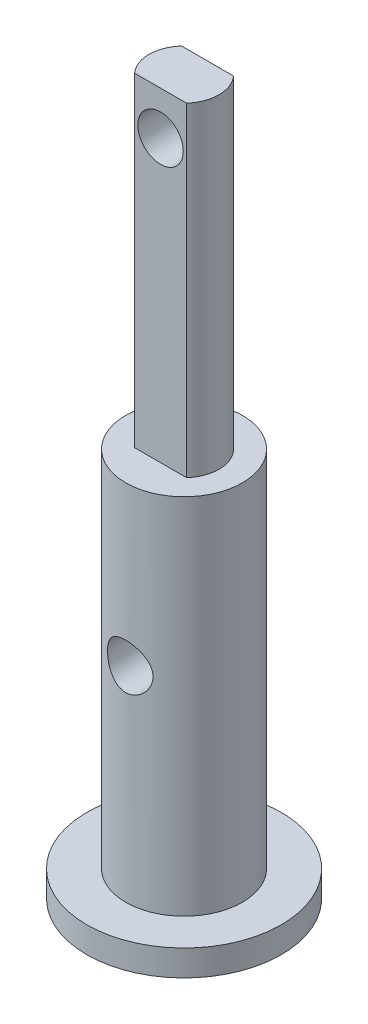
ISO-10303-21;
HEADER;
FILE_DESCRIPTION(('STEP AP214'),'2;1');
FILE_NAME('part.step','',(''),(''),'','','');
FILE_SCHEMA(('AUTOMOTIVE_DESIGN { 1 0 10303 214 1 1 1 1 }'));
ENDSEC;
DATA;
#1=APPLICATION_CONTEXT('core data for automotive mechanical design processes');
#2=APPLICATION_PROTOCOL_DEFINITION('international standard','automotive_design',2000,#1);
#3=PRODUCT_CONTEXT('',#1,'mechanical');
#4=PRODUCT('Part','Part','',(#3));
#5=PRODUCT_RELATED_PRODUCT_CATEGORY('part','',(#4));
#6=PRODUCT_DEFINITION_FORMATION('','',#4);
#7=PRODUCT_DEFINITION_CONTEXT('part definition',#1,'design');
#8=PRODUCT_DEFINITION('design','',#6,#7);
#9=PRODUCT_DEFINITION_SHAPE('','',#8);
#10=(LENGTH_UNIT() NAMED_UNIT(*) SI_UNIT(.MILLI.,.METRE.));
#11=(NAMED_UNIT(*) PLANE_ANGLE_UNIT() SI_UNIT($,.RADIAN.));
#12=(NAMED_UNIT(*) SI_UNIT($,.STERADIAN.) SOLID_ANGLE_UNIT());
#13=UNCERTAINTY_MEASURE_WITH_UNIT(LENGTH_MEASURE(1.E-05),#10,'distance_accuracy_value','');
#14=(GEOMETRIC_REPRESENTATION_CONTEXT(3) GLOBAL_UNCERTAINTY_ASSIGNED_CONTEXT((#13)) GLOBAL_UNIT_ASSIGNED_CONTEXT((#10,
#11,#12)) REPRESENTATION_CONTEXT('',''));
#15=CARTESIAN_POINT('',(0.,0.,0.));
#16=DIRECTION('',(0.,0.,1.));
#17=DIRECTION('',(1.,0.,0.));
#18=AXIS2_PLACEMENT_3D('',#15,#16,#17);
#19=CARTESIAN_POINT('',(0.,55.,0.));
#20=DIRECTION('',(0.,-1.,0.));
#21=DIRECTION('',(0.,0.,-1.));
#22=AXIS2_PLACEMENT_3D('',#19,#20,#21);
#23=CYLINDRICAL_SURFACE('',#22,4.5);
#24=CARTESIAN_POINT('',(0.,2.,0.));
#25=DIRECTION('',(0.,1.,0.));
#26=DIRECTION('',(0.,0.,1.));
#27=AXIS2_PLACEMENT_3D('',#24,#25,#26);
#28=CIRCLE('',#27,4.5);
#29=CARTESIAN_POINT('',(0.,2.,4.5));
#30=VERTEX_POINT('',#29);
#31=EDGE_CURVE('E143',#30,#30,#28,.T.);
#32=ORIENTED_EDGE('',*,*,#31,.T.);
#33=EDGE_LOOP('',(#32));
#34=FACE_BOUND('',#33,.T.);
#35=CARTESIAN_POINT('',(0.,30.,0.));
#36=DIRECTION('',(0.,1.,0.));
#37=DIRECTION('',(0.,0.,1.));
#38=AXIS2_PLACEMENT_3D('',#35,#36,#37);
#39=CIRCLE('',#38,4.5);
#40=CARTESIAN_POINT('',(0.,30.,4.5));
#41=VERTEX_POINT('',#40);
#42=EDGE_CURVE('E134',#41,#41,#39,.T.);
#43=ORIENTED_EDGE('',*,*,#42,.F.);
#44=EDGE_LOOP('',(#43));
#45=FACE_BOUND('',#44,.T.);
#46=CARTESIAN_POINT('',(1.75,17.75,4.14578098794425));
#47=CARTESIAN_POINT('',(1.75000491956867,17.8442150160928,4.14577620766959));
#48=CARTESIAN_POINT('',(1.74236653088156,17.9383991400736,4.14902733334679));
#49=CARTESIAN_POINT('',(1.71216780106661,18.1239108723661,4.16157989952544));
#50=CARTESIAN_POINT('',(1.68960873180986,18.2152387234578,4.17088082432782));
#51=CARTESIAN_POINT('',(1.63053548266134,18.392300175653,4.19432344476128));
#52=CARTESIAN_POINT('',(1.59405703251661,18.4780474473323,4.20845273680748));
#53=CARTESIAN_POINT('',(1.50830834046777,18.6422392853806,4.23993936412618));
#54=CARTESIAN_POINT('',(1.45903396823573,18.7206814826555,4.25729774118379));
#55=CARTESIAN_POINT('',(1.34626700880054,18.872236707857,4.29432746316903));
#56=CARTESIAN_POINT('',(1.28219880522748,18.9449040919029,4.31407028443289));
#57=CARTESIAN_POINT('',(1.14288162045414,19.078780700245,4.35305062896929));
#58=CARTESIAN_POINT('',(1.06763002363887,19.1399872364453,4.37228803279091));
#59=CARTESIAN_POINT('',(0.904654768169234,19.2513974018933,4.40894770380409));
#60=CARTESIAN_POINT('',(0.816572746996892,19.3011103215461,4.42627651449112));
#61=CARTESIAN_POINT('',(0.632501647053099,19.3848249270475,4.4563010064987));
#62=CARTESIAN_POINT('',(0.536515550519501,19.4188325068666,4.46899842553209));
#63=CARTESIAN_POINT('',(0.344050508253975,19.4685891340159,4.48782156001517));
#64=CARTESIAN_POINT('',(0.247797763460498,19.4851068003136,4.49422295127398));
#65=CARTESIAN_POINT('',(0.053687834449178,19.5018842291647,4.50072598926983));
#66=CARTESIAN_POINT('',(-0.0441687765833056,19.502149678412,4.50082983953306));
#67=CARTESIAN_POINT('',(-0.233174129943399,19.4868483040001,4.49489726026475));
#68=CARTESIAN_POINT('',(-0.324402981510445,19.472122115822,4.48918685447191));
#69=CARTESIAN_POINT('',(-0.502976620622431,19.4286782303249,4.4727015065481));
#70=CARTESIAN_POINT('',(-0.590321130735727,19.3999595353638,4.46192620330041));
#71=CARTESIAN_POINT('',(-0.760195076521448,19.3289888879838,4.43616953645727));
#72=CARTESIAN_POINT('',(-0.842633563402192,19.2865419858612,4.42112799285034));
#73=CARTESIAN_POINT('',(-0.999427181269501,19.1894977009259,4.38834487559258));
#74=CARTESIAN_POINT('',(-1.07377959313019,19.1348962495612,4.37060239847522));
#75=CARTESIAN_POINT('',(-1.21721796615108,19.0111126204878,4.33292278877973));
#76=CARTESIAN_POINT('',(-1.28568491942954,18.9412327457279,4.31291779588564));
#77=CARTESIAN_POINT('',(-1.41017275772126,18.7908853932342,4.27383661959412));
#78=CARTESIAN_POINT('',(-1.46619001365826,18.7104148391816,4.2547607082852));
#79=CARTESIAN_POINT('',(-1.56549698383146,18.5385505307153,4.21925110339265));
#80=CARTESIAN_POINT('',(-1.60842680262267,18.4469310346612,4.2028969394915));
#81=CARTESIAN_POINT('',(-1.67800752290595,18.2569582628716,4.17560826147973));
#82=CARTESIAN_POINT('',(-1.70466830932826,18.1586091165,4.1646704571967));
#83=CARTESIAN_POINT('',(-1.73949254719701,17.9641197895499,4.15024126483539));
#84=CARTESIAN_POINT('',(-1.74864666859994,17.8681868484455,4.14635176720071));
#85=CARTESIAN_POINT('',(-1.75107315977272,17.6760977564343,4.14532846788437));
#86=CARTESIAN_POINT('',(-1.74434994693427,17.5799416750457,4.14819278715552));
#87=CARTESIAN_POINT('',(-1.71611302180106,17.3954437403132,4.15994768707806));
#88=CARTESIAN_POINT('',(-1.69539557175102,17.3069568519628,4.16851349196302));
#89=CARTESIAN_POINT('',(-1.64077712714897,17.1347654316745,4.19031128967705));
#90=CARTESIAN_POINT('',(-1.6068733092301,17.0510619283246,4.20354428175289));
#91=CARTESIAN_POINT('',(-1.52535390234436,16.88715535,4.23382230250486));
#92=CARTESIAN_POINT('',(-1.47725249320867,16.8072184934821,4.25099653326073));
#93=CARTESIAN_POINT('',(-1.36920895274044,16.6562017163722,4.28701595404022));
#94=CARTESIAN_POINT('',(-1.30926221352474,16.5851252601167,4.30586179274909));
#95=CARTESIAN_POINT('',(-1.1743351898694,16.4487473219962,4.34467372079203));
#96=CARTESIAN_POINT('',(-1.09860240917596,16.3841840654039,4.36462725336802));
#97=CARTESIAN_POINT('',(-0.936894214477023,16.268579819505,4.40217110719148));
#98=CARTESIAN_POINT('',(-0.850918567711629,16.2175391375717,4.41976137471655));
#99=CARTESIAN_POINT('',(-0.671034282103451,16.1306899990885,4.45061965359563));
#100=CARTESIAN_POINT('',(-0.57714026964596,16.0948541649697,4.4638954233764));
#101=CARTESIAN_POINT('',(-0.384017264458009,16.0397073484483,4.48463385344078));
#102=CARTESIAN_POINT('',(-0.284791020586052,16.0203879367722,4.49209947879816));
#103=CARTESIAN_POINT('',(-0.09046783593177,15.9997816848924,4.50007593038988));
#104=CARTESIAN_POINT('',(0.00450254741818884,15.9974488962156,4.50099010179516));
#105=CARTESIAN_POINT('',(0.193429667217862,16.0081523229848,4.49683312605338));
#106=CARTESIAN_POINT('',(0.287386540229063,16.0211864411002,4.49176279569256));
#107=CARTESIAN_POINT('',(0.468953190894024,16.0615110066291,4.47640068008718));
#108=CARTESIAN_POINT('',(0.556666794983186,16.0883951772457,4.46625792486151));
#109=CARTESIAN_POINT('',(0.72633325835267,16.155240152611,4.44182328641121));
#110=CARTESIAN_POINT('',(0.808285024352276,16.1952034309654,4.42753061838587));
#111=CARTESIAN_POINT('',(0.967998954883363,16.289032859464,4.39544096241812));
#112=CARTESIAN_POINT('',(1.04542560274751,16.3434264992434,4.37751894300444));
#113=CARTESIAN_POINT('',(1.1903666728042,16.4637621620976,4.34034965591831));
#114=CARTESIAN_POINT('',(1.25787744646467,16.5297084164686,4.32110190425195));
#115=CARTESIAN_POINT('',(1.38509600830639,16.6757937533034,4.28207807683418));
#116=CARTESIAN_POINT('',(1.44412846688135,16.7565323488612,4.26233563443846));
#117=CARTESIAN_POINT('',(1.54784334935148,16.9273991909808,4.22577986123555));
#118=CARTESIAN_POINT('',(1.59252211256594,17.0175298250824,4.20896727814162));
#119=CARTESIAN_POINT('',(1.66878219150546,17.2120563584456,4.17935236080739));
#120=CARTESIAN_POINT('',(1.69910149724132,17.317016049265,4.16695473443663));
#121=CARTESIAN_POINT('',(1.73969940761536,17.5313334530595,4.15017507674994));
#122=CARTESIAN_POINT('',(1.74999429209613,17.6406875195152,4.14578653423297));
#123=CARTESIAN_POINT('',(1.75,17.75,4.14578098794425));
#124=B_SPLINE_CURVE_WITH_KNOTS('',3,(#46,#47,#48,#49,#50,#51,#52,#53,#54,#55,#56,#57,#58,#59,
#60,#61,#62,#63,#64,#65,#66,#67,#68,#69,#70,#71,#72,#73,#74,#75,#76,#77,#78,#79,#80,#81,#82,#83,
#84,#85,#86,#87,#88,#89,#90,#91,#92,#93,#94,#95,#96,#97,#98,#99,#100,#101,#102,#103,#104,#105,
#106,#107,#108,#109,#110,#111,#112,#113,#114,#115,#116,#117,#118,#119,#120,#121,#122,#123),
.UNSPECIFIED.,.T.,.F.,(4,2,2,2,2,2,2,2,2,2,2,2,2,2,2,2,2,2,2,2,2,2,2,2,2,2,2,2,2,2,2,2,2,2,2,2,
2,2,4),(0.,0.282237235150779,0.564450414889369,0.845944000670505,1.12752856145902,
1.42282786999549,1.718196353281,2.02448986264011,2.33066833119899,2.6227486960292,
2.91472686058053,3.19118823225721,3.46766931804866,3.74826299367323,4.02895073540889,
4.32717019309611,4.6254764678167,4.93136883476675,5.23707515849219,5.52490132525224,
5.81264742245516,6.08526400792906,6.35793899619764,6.64131312458807,6.92479770449228,
7.22786739678048,7.5309439773683,7.83347250384939,8.13584654042273,8.41943097575282,
8.70297671093821,8.97864219222514,9.2543598393148,9.54202720595761,9.8298001556641,
10.1341837751573,10.4386449613189,10.7663757962473,11.0938400746497),.UNSPECIFIED.);
#125=CARTESIAN_POINT('',(1.75,17.75,4.14578098794425));
#126=VERTEX_POINT('',#125);
#127=EDGE_CURVE('E153',#126,#126,#124,.T.);
#128=ORIENTED_EDGE('',*,*,#127,.F.);
#129=EDGE_LOOP('',(#128));
#130=FACE_BOUND('',#129,.T.);
#131=CARTESIAN_POINT('',(0.,19.5,-4.5));
#132=CARTESIAN_POINT('',(0.0945216116231121,19.5000046611473,-4.50000357890976));
#133=CARTESIAN_POINT('',(0.189012588974275,19.4923185058166,-4.49699657235603));
#134=CARTESIAN_POINT('',(0.375157095621193,19.4619126053374,-4.48530338756881));
#135=CARTESIAN_POINT('',(0.466811257942965,19.4391962398206,-4.47661848604882));
#136=CARTESIAN_POINT('',(0.644569415695736,19.3796639572406,-4.45449751263017));
#137=CARTESIAN_POINT('',(0.730684201241586,19.342876484572,-4.44107102989426));
#138=CARTESIAN_POINT('',(0.895509610305322,19.2563966061002,-4.41079282434057));
#139=CARTESIAN_POINT('',(0.974218091743783,19.2067004823406,-4.39394011500362));
#140=CARTESIAN_POINT('',(1.12555176600737,19.0934746560063,-4.35768696402247));
#141=CARTESIAN_POINT('',(1.19779891271444,19.0294641879905,-4.33821073882029));
#142=CARTESIAN_POINT('',(1.33084266886211,18.8904473299816,-4.29926410972336));
#143=CARTESIAN_POINT('',(1.39163537873751,18.8154372106502,-4.27979371005603));
#144=CARTESIAN_POINT('',(1.5025400591669,18.6527508484564,-4.24216350922567));
#145=CARTESIAN_POINT('',(1.55210248066998,18.5646774942171,-4.22409192828478));
#146=CARTESIAN_POINT('',(1.63554172723799,18.3806336879447,-4.19249433932349));
#147=CARTESIAN_POINT('',(1.66942535668049,18.2846666829832,-4.1789663601433));
#148=CARTESIAN_POINT('',(1.71902708764804,18.0919231620596,-4.15880257084895));
#149=CARTESIAN_POINT('',(1.73547043602239,17.9953629498096,-4.15189286416949));
#150=CARTESIAN_POINT('',(1.75199151472945,17.8006254802364,-4.14495045931833));
#151=CARTESIAN_POINT('',(1.75207667610848,17.7024489774177,-4.14491463854117));
#152=CARTESIAN_POINT('',(1.73643069370047,17.5140804405754,-4.15148930319339));
#153=CARTESIAN_POINT('',(1.72172945761323,17.4237848811768,-4.15766700235832));
#154=CARTESIAN_POINT('',(1.67863865338661,17.2470609047274,-4.17524945770577));
#155=CARTESIAN_POINT('',(1.65024686146123,17.1606331184205,-4.18665506305328));
#156=CARTESIAN_POINT('',(1.58005179443055,16.9920829709595,-4.21365271626082));
#157=CARTESIAN_POINT('',(1.53799445721783,16.9100795174722,-4.22932307646113));
#158=CARTESIAN_POINT('',(1.4418398712837,16.7540045314757,-4.26306100406182));
#159=CARTESIAN_POINT('',(1.3877382532953,16.6799358919347,-4.28112944044196));
#160=CARTESIAN_POINT('',(1.26440337893232,16.5361664466813,-4.31922892923803));
#161=CARTESIAN_POINT('',(1.19435591484142,16.4671748241548,-4.33930715956177));
#162=CARTESIAN_POINT('',(1.04346328587166,16.3416980466897,-4.37804136065515));
#163=CARTESIAN_POINT('',(0.962616205925904,16.285215114616,-4.39669707825065));
#164=CARTESIAN_POINT('',(0.79049955101908,16.1854965215154,-4.43090662383363));
#165=CARTESIAN_POINT('',(0.699070445395454,16.1425138017854,-4.44639951393914));
#166=CARTESIAN_POINT('',(0.509524956315268,16.072779641107,-4.47208114014078));
#167=CARTESIAN_POINT('',(0.411411801645559,16.0460204242378,-4.48227241696576));
#168=CARTESIAN_POINT('',(0.217238781026642,16.0108950453183,-4.49574685184384));
#169=CARTESIAN_POINT('',(0.121376185198679,16.0015749630205,-4.49938783597809));
#170=CARTESIAN_POINT('',(-0.0706022558697274,15.9987933405476,-4.50046894131888));
#171=CARTESIAN_POINT('',(-0.166718034214668,16.0053279634131,-4.49791056281854));
#172=CARTESIAN_POINT('',(-0.352242008871048,16.0333578281044,-4.48711560256918));
#173=CARTESIAN_POINT('',(-0.441762429458591,16.0542138123407,-4.47912178447378));
#174=CARTESIAN_POINT('',(-0.615959651152386,16.1094372848695,-4.45850787906716));
#175=CARTESIAN_POINT('',(-0.700635823764016,16.1438065218434,-4.44588719303079));
#176=CARTESIAN_POINT('',(-0.865605234361161,16.2261940265154,-4.41678144851863));
#177=CARTESIAN_POINT('',(-0.94568963809834,16.2745922237463,-4.40019144454658));
#178=CARTESIAN_POINT('',(-1.09687647672476,16.3832389438563,-4.3649625001582));
#179=CARTESIAN_POINT('',(-1.16797541280995,16.4434920596534,-4.34632276685946));
#180=CARTESIAN_POINT('',(-1.30382380300945,16.5785567745889,-4.3075912210957));
#181=CARTESIAN_POINT('',(-1.36789970134047,16.6540424457462,-4.28748140660687));
#182=CARTESIAN_POINT('',(-1.48262564949144,16.8150697621129,-4.24917515368351));
#183=CARTESIAN_POINT('',(-1.53327397046124,16.9006127001879,-4.23097896181674));
#184=CARTESIAN_POINT('',(-1.61989819212988,17.0803396652427,-4.19858244892526));
#185=CARTESIAN_POINT('',(-1.65576827914436,17.1745802905001,-4.18441116332615));
#186=CARTESIAN_POINT('',(-1.71087089906813,17.3684763129435,-4.16218937940006));
#187=CARTESIAN_POINT('',(-1.73011480230192,17.4681279599887,-4.15413469850287));
#188=CARTESIAN_POINT('',(-1.75036340880478,17.6626580753337,-4.14564074731701));
#189=CARTESIAN_POINT('',(-1.75252783727917,17.7573955531328,-4.14471735003347));
#190=CARTESIAN_POINT('',(-1.74156812524649,17.9458122352943,-4.14933433805868));
#191=CARTESIAN_POINT('',(-1.72844567598556,18.039491555567,-4.15487400833349));
#192=CARTESIAN_POINT('',(-1.68821256290743,18.219756054294,-4.17137652703369));
#193=CARTESIAN_POINT('',(-1.66161232658634,18.3064749324517,-4.18214092060007));
#194=CARTESIAN_POINT('',(-1.59564352261878,18.474260924601,-4.20775087444452));
#195=CARTESIAN_POINT('',(-1.55627161906199,18.5553265552574,-4.22259750083155));
#196=CARTESIAN_POINT('',(-1.46336245966471,18.7143724384423,-4.25571696636597));
#197=CARTESIAN_POINT('',(-1.40916363976662,18.7919358525947,-4.27413362217158));
#198=CARTESIAN_POINT('',(-1.28913141336766,18.9372352512418,-4.31185518542399));
#199=CARTESIAN_POINT('',(-1.22329417160084,19.0049679827436,-4.33116038412078));
#200=CARTESIAN_POINT('',(-1.07714479787779,19.1328363512943,-4.36987394857856));
#201=CARTESIAN_POINT('',(-0.99620157892544,19.1922732624713,-4.38921913759408));
#202=CARTESIAN_POINT('',(-0.824791042184334,19.2967041336143,-4.42463279405307));
#203=CARTESIAN_POINT('',(-0.734321732852542,19.3416950654829,-4.44070057424458));
#204=CARTESIAN_POINT('',(-0.539177942484051,19.4184053086274,-4.46874642995128));
#205=CARTESIAN_POINT('',(-0.433946807083797,19.4488710538204,-4.480325733796));
#206=CARTESIAN_POINT('',(-0.219128275784338,19.4896595854111,-4.49594815787146));
#207=CARTESIAN_POINT('',(-0.109543565297218,19.4999945980747,-4.49999585230798));
#208=CARTESIAN_POINT('',(0.,19.5,-4.5));
#209=B_SPLINE_CURVE_WITH_KNOTS('',3,(#131,#132,#133,#134,#135,#136,#137,#138,#139,#140,#141,
#142,#143,#144,#145,#146,#147,#148,#149,#150,#151,#152,#153,#154,#155,#156,#157,#158,#159,#160,
#161,#162,#163,#164,#165,#166,#167,#168,#169,#170,#171,#172,#173,#174,#175,#176,#177,#178,#179,
#180,#181,#182,#183,#184,#185,#186,#187,#188,#189,#190,#191,#192,#193,#194,#195,#196,#197,#198,
#199,#200,#201,#202,#203,#204,#205,#206,#207,#208),.UNSPECIFIED.,.T.,.F.,(4,2,2,2,2,2,2,2,2,2,2,
2,2,2,2,2,2,2,2,2,2,2,2,2,2,2,2,2,2,2,2,2,2,2,2,2,2,2,4),(0.,0.283160503864036,
0.566257359041776,0.84878493978484,1.13139398467333,1.42550694762591,1.71971985862072,
2.02617249149161,2.33249200315933,2.62550346855177,2.91838182708358,3.19218218311022,
3.46602702809766,3.74528609985655,4.02464664313579,4.32431978760004,4.6240461430173,
4.92909277058724,5.23399307356053,5.5216638359586,5.8092649867878,6.08479830266446,
6.36036728564719,6.64423643005734,6.92821577043194,7.22992485806411,7.53167277301019,
7.83554518222,8.13920961411628,8.42206063024588,8.70488035644986,8.97771101372535,
9.2506129907764,9.53856816273043,9.82661840345188,10.1319344787653,10.437314511264,
10.7656761078697,11.0938382139952),.UNSPECIFIED.);
#210=CARTESIAN_POINT('',(0.,19.5,-4.5));
#211=VERTEX_POINT('',#210);
#212=EDGE_CURVE('E43',#211,#211,#209,.T.);
#213=ORIENTED_EDGE('',*,*,#212,.F.);
#214=EDGE_LOOP('',(#213));
#215=FACE_BOUND('',#214,.T.);
#216=ADVANCED_FACE('F39',(#34,#45,#130,#215),#23,.T.);
#217=CARTESIAN_POINT('',(0.,2.,0.));
#218=DIRECTION('',(0.,1.,0.));
#219=DIRECTION('',(0.,0.,1.));
#220=AXIS2_PLACEMENT_3D('',#217,#218,#219);
#221=PLANE('',#220);
#222=CARTESIAN_POINT('',(0.,2.,0.));
#223=DIRECTION('',(0.,1.,0.));
#224=DIRECTION('',(0.,0.,1.));
#225=AXIS2_PLACEMENT_3D('',#222,#223,#224);
#226=CIRCLE('',#225,7.5);
#227=CARTESIAN_POINT('',(0.,2.,7.5));
#228=VERTEX_POINT('',#227);
#229=EDGE_CURVE('E11',#228,#228,#226,.T.);
#230=ORIENTED_EDGE('',*,*,#229,.T.);
#231=EDGE_LOOP('',(#230));
#232=FACE_BOUND('',#231,.T.);
#233=ORIENTED_EDGE('',*,*,#31,.F.);
#234=EDGE_LOOP('',(#233));
#235=FACE_BOUND('',#234,.T.);
#236=ADVANCED_FACE('F191',(#232,#235),#221,.T.);
#237=CARTESIAN_POINT('',(0.,0.,0.));
#238=DIRECTION('',(0.,1.,0.));
#239=DIRECTION('',(0.,0.,1.));
#240=AXIS2_PLACEMENT_3D('',#237,#238,#239);
#241=PLANE('',#240);
#242=CARTESIAN_POINT('',(0.,0.,0.));
#243=DIRECTION('',(0.,1.,0.));
#244=DIRECTION('',(0.,0.,1.));
#245=AXIS2_PLACEMENT_3D('',#242,#243,#244);
#246=CIRCLE('',#245,7.5);
#247=CARTESIAN_POINT('',(0.,0.,7.5));
#248=VERTEX_POINT('',#247);
#249=EDGE_CURVE('E54',#248,#248,#246,.T.);
#250=ORIENTED_EDGE('',*,*,#249,.F.);
#251=EDGE_LOOP('',(#250));
#252=FACE_BOUND('',#251,.T.);
#253=ADVANCED_FACE('F196',(#252),#241,.F.);
#254=CARTESIAN_POINT('',(0.,2.,0.));
#255=DIRECTION('',(0.,-1.,0.));
#256=DIRECTION('',(0.,0.,-1.));
#257=AXIS2_PLACEMENT_3D('',#254,#255,#256);
#258=CYLINDRICAL_SURFACE('',#257,7.5);
#259=ORIENTED_EDGE('',*,*,#229,.F.);
#260=EDGE_LOOP('',(#259));
#261=FACE_BOUND('',#260,.T.);
#262=ORIENTED_EDGE('',*,*,#249,.T.);
#263=EDGE_LOOP('',(#262));
#264=FACE_BOUND('',#263,.T.);
#265=ADVANCED_FACE('F41',(#261,#264),#258,.T.);
#266=CARTESIAN_POINT('',(0.,30.,0.));
#267=DIRECTION('',(0.,1.,0.));
#268=DIRECTION('',(0.,0.,1.));
#269=AXIS2_PLACEMENT_3D('',#266,#267,#268);
#270=PLANE('',#269);
#271=DIRECTION('',(-1.,0.,0.));
#272=VECTOR('',#271,1.);
#273=CARTESIAN_POINT('',(-2.,30.,-1.8113761853665));
#274=LINE('',#273,#272);
#275=CARTESIAN_POINT('',(2.,30.,-1.8113761853665));
#276=VERTEX_POINT('',#275);
#277=CARTESIAN_POINT('',(-2.,30.,-1.8113761853665));
#278=VERTEX_POINT('',#277);
#279=EDGE_CURVE('E101',#276,#278,#274,.T.);
#280=ORIENTED_EDGE('',*,*,#279,.F.);
#281=CARTESIAN_POINT('',(0.,30.,0.));
#282=DIRECTION('',(0.,1.,0.));
#283=DIRECTION('',(0.,0.,1.));
#284=AXIS2_PLACEMENT_3D('',#281,#282,#283);
#285=CIRCLE('',#284,2.69834832534884);
#286=CARTESIAN_POINT('',(2.,30.,1.8113761853665));
#287=VERTEX_POINT('',#286);
#288=EDGE_CURVE('E70',#287,#276,#285,.T.);
#289=ORIENTED_EDGE('',*,*,#288,.F.);
#290=DIRECTION('',(1.,0.,0.));
#291=VECTOR('',#290,1.);
#292=CARTESIAN_POINT('',(-2.,30.,1.8113761853665));
#293=LINE('',#292,#291);
#294=CARTESIAN_POINT('',(-2.,30.,1.8113761853665));
#295=VERTEX_POINT('',#294);
#296=EDGE_CURVE('E92',#295,#287,#293,.T.);
#297=ORIENTED_EDGE('',*,*,#296,.F.);
#298=CARTESIAN_POINT('',(0.,30.,0.));
#299=DIRECTION('',(0.,1.,0.));
#300=DIRECTION('',(0.,0.,1.));
#301=AXIS2_PLACEMENT_3D('',#298,#299,#300);
#302=CIRCLE('',#301,2.69834832534884);
#303=EDGE_CURVE('E106',#278,#295,#302,.T.);
#304=ORIENTED_EDGE('',*,*,#303,.F.);
#305=EDGE_LOOP('',(#280,#289,#297,#304));
#306=FACE_BOUND('',#305,.T.);
#307=ORIENTED_EDGE('',*,*,#42,.T.);
#308=EDGE_LOOP('',(#307));
#309=FACE_BOUND('',#308,.T.);
#310=ADVANCED_FACE('F104',(#306,#309),#270,.T.);
#311=CARTESIAN_POINT('',(0.,30.,0.));
#312=DIRECTION('',(0.,1.,0.));
#313=DIRECTION('',(0.,0.,1.));
#314=AXIS2_PLACEMENT_3D('',#311,#312,#313);
#315=CYLINDRICAL_SURFACE('',#314,2.69834832534884);
#316=CARTESIAN_POINT('',(0.,55.,0.));
#317=DIRECTION('',(0.,1.,0.));
#318=DIRECTION('',(0.,0.,1.));
#319=AXIS2_PLACEMENT_3D('',#316,#317,#318);
#320=CIRCLE('',#319,2.69834832534884);
#321=CARTESIAN_POINT('',(-2.,55.,-1.8113761853665));
#322=VERTEX_POINT('',#321);
#323=CARTESIAN_POINT('',(-2.,55.,1.8113761853665));
#324=VERTEX_POINT('',#323);
#325=EDGE_CURVE('E125',#322,#324,#320,.T.);
#326=ORIENTED_EDGE('',*,*,#325,.F.);
#327=DIRECTION('',(0.,1.,0.));
#328=VECTOR('',#327,1.);
#329=CARTESIAN_POINT('',(-2.,30.,-1.8113761853665));
#330=LINE('',#329,#328);
#331=EDGE_CURVE('E111',#278,#322,#330,.T.);
#332=ORIENTED_EDGE('',*,*,#331,.F.);
#333=ORIENTED_EDGE('',*,*,#303,.T.);
#334=DIRECTION('',(0.,1.,0.));
#335=VECTOR('',#334,1.);
#336=CARTESIAN_POINT('',(-2.,30.,1.8113761853665));
#337=LINE('',#336,#335);
#338=EDGE_CURVE('E90',#295,#324,#337,.T.);
#339=ORIENTED_EDGE('',*,*,#338,.T.);
#340=EDGE_LOOP('',(#326,#332,#333,#339));
#341=FACE_BOUND('',#340,.T.);
#342=ADVANCED_FACE('F110',(#341),#315,.T.);
#343=CARTESIAN_POINT('',(-2.,30.,-1.8113761853665));
#344=DIRECTION('',(0.,0.,-1.));
#345=DIRECTION('',(-1.,0.,0.));
#346=AXIS2_PLACEMENT_3D('',#343,#344,#345);
#347=PLANE('',#346);
#348=CARTESIAN_POINT('',(0.,51.6607988882271,-1.8113761853665));
#349=DIRECTION('',(0.,0.,-1.));
#350=DIRECTION('',(-1.,0.,0.));
#351=AXIS2_PLACEMENT_3D('',#348,#349,#350);
#352=CIRCLE('',#351,1.75);
#353=CARTESIAN_POINT('',(-1.75,51.6607988882271,-1.8113761853665));
#354=VERTEX_POINT('',#353);
#355=EDGE_CURVE('E119',#354,#354,#352,.F.);
#356=ORIENTED_EDGE('',*,*,#355,.T.);
#357=EDGE_LOOP('',(#356));
#358=FACE_BOUND('',#357,.T.);
#359=DIRECTION('',(-1.,0.,0.));
#360=VECTOR('',#359,1.);
#361=CARTESIAN_POINT('',(-2.,55.,-1.8113761853665));
#362=LINE('',#361,#360);
#363=CARTESIAN_POINT('',(2.,55.,-1.8113761853665));
#364=VERTEX_POINT('',#363);
#365=EDGE_CURVE('E113',#364,#322,#362,.T.);
#366=ORIENTED_EDGE('',*,*,#365,.F.);
#367=DIRECTION('',(0.,1.,0.));
#368=VECTOR('',#367,1.);
#369=CARTESIAN_POINT('',(2.,30.,-1.8113761853665));
#370=LINE('',#369,#368);
#371=EDGE_CURVE('E135',#276,#364,#370,.T.);
#372=ORIENTED_EDGE('',*,*,#371,.F.);
#373=ORIENTED_EDGE('',*,*,#279,.T.);
#374=ORIENTED_EDGE('',*,*,#331,.T.);
#375=EDGE_LOOP('',(#366,#372,#373,#374));
#376=FACE_BOUND('',#375,.T.);
#377=ADVANCED_FACE('F173',(#358,#376),#347,.T.);
#378=CARTESIAN_POINT('',(0.,30.,0.));
#379=DIRECTION('',(0.,1.,0.));
#380=DIRECTION('',(0.,0.,1.));
#381=AXIS2_PLACEMENT_3D('',#378,#379,#380);
#382=CYLINDRICAL_SURFACE('',#381,2.69834832534884);
#383=CARTESIAN_POINT('',(0.,55.,0.));
#384=DIRECTION('',(0.,1.,0.));
#385=DIRECTION('',(0.,0.,1.));
#386=AXIS2_PLACEMENT_3D('',#383,#384,#385);
#387=CIRCLE('',#386,2.69834832534884);
#388=CARTESIAN_POINT('',(2.,55.,1.8113761853665));
#389=VERTEX_POINT('',#388);
#390=EDGE_CURVE('E62',#389,#364,#387,.T.);
#391=ORIENTED_EDGE('',*,*,#390,.F.);
#392=DIRECTION('',(0.,1.,0.));
#393=VECTOR('',#392,1.);
#394=CARTESIAN_POINT('',(2.,30.,1.8113761853665));
#395=LINE('',#394,#393);
#396=EDGE_CURVE('E100',#287,#389,#395,.T.);
#397=ORIENTED_EDGE('',*,*,#396,.F.);
#398=ORIENTED_EDGE('',*,*,#288,.T.);
#399=ORIENTED_EDGE('',*,*,#371,.T.);
#400=EDGE_LOOP('',(#391,#397,#398,#399));
#401=FACE_BOUND('',#400,.T.);
#402=ADVANCED_FACE('F176',(#401),#382,.T.);
#403=CARTESIAN_POINT('',(-2.,30.,1.8113761853665));
#404=DIRECTION('',(0.,0.,1.));
#405=DIRECTION('',(1.,0.,0.));
#406=AXIS2_PLACEMENT_3D('',#403,#404,#405);
#407=PLANE('',#406);
#408=CARTESIAN_POINT('',(0.,51.6607988882271,1.8113761853665));
#409=DIRECTION('',(0.,0.,1.));
#410=DIRECTION('',(1.,0.,0.));
#411=AXIS2_PLACEMENT_3D('',#408,#409,#410);
#412=CIRCLE('',#411,1.75);
#413=CARTESIAN_POINT('',(1.75,51.6607988882271,1.8113761853665));
#414=VERTEX_POINT('',#413);
#415=EDGE_CURVE('E150',#414,#414,#412,.F.);
#416=ORIENTED_EDGE('',*,*,#415,.T.);
#417=EDGE_LOOP('',(#416));
#418=FACE_BOUND('',#417,.T.);
#419=DIRECTION('',(1.,0.,0.));
#420=VECTOR('',#419,1.);
#421=CARTESIAN_POINT('',(-2.,55.,1.8113761853665));
#422=LINE('',#421,#420);
#423=EDGE_CURVE('E94',#324,#389,#422,.T.);
#424=ORIENTED_EDGE('',*,*,#423,.F.);
#425=ORIENTED_EDGE('',*,*,#338,.F.);
#426=ORIENTED_EDGE('',*,*,#296,.T.);
#427=ORIENTED_EDGE('',*,*,#396,.T.);
#428=EDGE_LOOP('',(#424,#425,#426,#427));
#429=FACE_BOUND('',#428,.T.);
#430=ADVANCED_FACE('F91',(#418,#429),#407,.T.);
#431=CARTESIAN_POINT('',(0.,55.,0.));
#432=DIRECTION('',(0.,1.,0.));
#433=DIRECTION('',(0.,0.,1.));
#434=AXIS2_PLACEMENT_3D('',#431,#432,#433);
#435=PLANE('',#434);
#436=ORIENTED_EDGE('',*,*,#365,.T.);
#437=ORIENTED_EDGE('',*,*,#325,.T.);
#438=ORIENTED_EDGE('',*,*,#423,.T.);
#439=ORIENTED_EDGE('',*,*,#390,.T.);
#440=EDGE_LOOP('',(#436,#437,#438,#439));
#441=FACE_BOUND('',#440,.T.);
#442=ADVANCED_FACE('F171',(#441),#435,.T.);
#443=CARTESIAN_POINT('',(0.,51.6607988882271,-26.8113761853665));
#444=DIRECTION('',(0.,0.,1.));
#445=DIRECTION('',(1.,0.,0.));
#446=AXIS2_PLACEMENT_3D('',#443,#444,#445);
#447=CYLINDRICAL_SURFACE('',#446,1.75);
#448=ORIENTED_EDGE('',*,*,#355,.F.);
#449=EDGE_LOOP('',(#448));
#450=FACE_BOUND('',#449,.T.);
#451=ORIENTED_EDGE('',*,*,#415,.F.);
#452=EDGE_LOOP('',(#451));
#453=FACE_BOUND('',#452,.T.);
#454=ADVANCED_FACE('F166',(#450,#453),#447,.F.);
#455=CARTESIAN_POINT('',(0.,17.75,-26.8113761853665));
#456=DIRECTION('',(0.,0.,1.));
#457=DIRECTION('',(1.,0.,0.));
#458=AXIS2_PLACEMENT_3D('',#455,#456,#457);
#459=CYLINDRICAL_SURFACE('',#458,1.75);
#460=ORIENTED_EDGE('',*,*,#127,.T.);
#461=EDGE_LOOP('',(#460));
#462=FACE_BOUND('',#461,.T.);
#463=ORIENTED_EDGE('',*,*,#212,.T.);
#464=EDGE_LOOP('',(#463));
#465=FACE_BOUND('',#464,.T.);
#466=ADVANCED_FACE('F162',(#462,#465),#459,.F.);
#467=CLOSED_SHELL('',(#216,#236,#253,#265,#310,#342,#377,#402,#430,#442,#454,#466));
#468=MANIFOLD_SOLID_BREP('B2',#467);
#469=ADVANCED_BREP_SHAPE_REPRESENTATION('',(#18,#468),#14);
#470=SHAPE_DEFINITION_REPRESENTATION(#9,#469);
ENDSEC;
END-ISO-10303-21;
